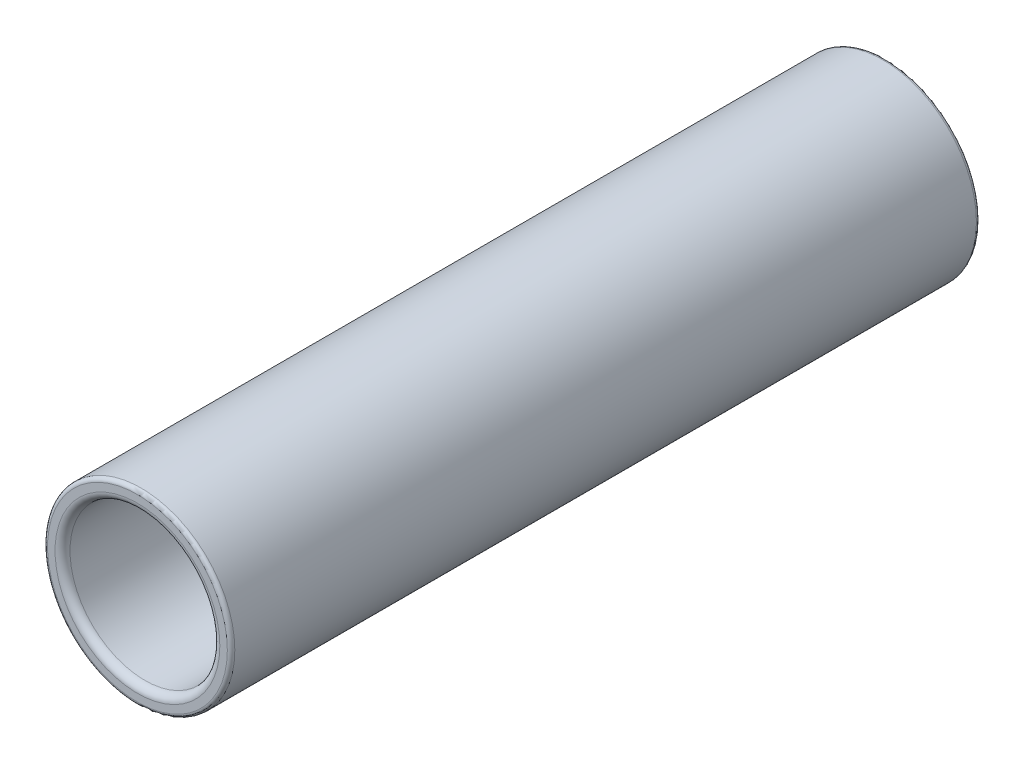
ISO-10303-21;
HEADER;
FILE_DESCRIPTION(('STEP AP214'),'2;1');
FILE_NAME('part.step','',(''),(''),'','','');
FILE_SCHEMA(('AUTOMOTIVE_DESIGN { 1 0 10303 214 1 1 1 1 }'));
ENDSEC;
DATA;
#1=APPLICATION_CONTEXT('core data for automotive mechanical design processes');
#2=APPLICATION_PROTOCOL_DEFINITION('international standard','automotive_design',2000,#1);
#3=PRODUCT_CONTEXT('',#1,'mechanical');
#4=PRODUCT('Part','Part','',(#3));
#5=PRODUCT_RELATED_PRODUCT_CATEGORY('part','',(#4));
#6=PRODUCT_DEFINITION_FORMATION('','',#4);
#7=PRODUCT_DEFINITION_CONTEXT('part definition',#1,'design');
#8=PRODUCT_DEFINITION('design','',#6,#7);
#9=PRODUCT_DEFINITION_SHAPE('','',#8);
#10=(LENGTH_UNIT() NAMED_UNIT(*) SI_UNIT(.MILLI.,.METRE.));
#11=(NAMED_UNIT(*) PLANE_ANGLE_UNIT() SI_UNIT($,.RADIAN.));
#12=(NAMED_UNIT(*) SI_UNIT($,.STERADIAN.) SOLID_ANGLE_UNIT());
#13=UNCERTAINTY_MEASURE_WITH_UNIT(LENGTH_MEASURE(1.E-05),#10,'distance_accuracy_value','');
#14=(GEOMETRIC_REPRESENTATION_CONTEXT(3) GLOBAL_UNCERTAINTY_ASSIGNED_CONTEXT((#13)) GLOBAL_UNIT_ASSIGNED_CONTEXT((#10,
#11,#12)) REPRESENTATION_CONTEXT('',''));
#15=CARTESIAN_POINT('',(0.,0.,0.));
#16=DIRECTION('',(0.,0.,1.));
#17=DIRECTION('',(1.,0.,0.));
#18=AXIS2_PLACEMENT_3D('',#15,#16,#17);
#19=CARTESIAN_POINT('',(0.,0.,20.));
#20=DIRECTION('',(0.,0.,1.));
#21=DIRECTION('',(1.,0.,0.));
#22=AXIS2_PLACEMENT_3D('',#19,#20,#21);
#23=PLANE('',#22);
#24=CARTESIAN_POINT('',(0.,0.,20.));
#25=DIRECTION('',(0.,0.,1.));
#26=DIRECTION('',(1.,0.,0.));
#27=AXIS2_PLACEMENT_3D('',#24,#25,#26);
#28=CIRCLE('',#27,2.2);
#29=CARTESIAN_POINT('',(2.2,0.,20.));
#30=VERTEX_POINT('',#29);
#31=EDGE_CURVE('E10',#30,#30,#28,.F.);
#32=ORIENTED_EDGE('',*,*,#31,.T.);
#33=EDGE_LOOP('',(#32));
#34=FACE_BOUND('',#33,.T.);
#35=CARTESIAN_POINT('',(0.,0.,20.));
#36=DIRECTION('',(0.,0.,1.));
#37=DIRECTION('',(1.,0.,0.));
#38=AXIS2_PLACEMENT_3D('',#35,#36,#37);
#39=CIRCLE('',#38,2.4);
#40=CARTESIAN_POINT('',(2.4,0.,20.));
#41=VERTEX_POINT('',#40);
#42=EDGE_CURVE('E61',#41,#41,#39,.T.);
#43=ORIENTED_EDGE('',*,*,#42,.T.);
#44=EDGE_LOOP('',(#43));
#45=FACE_BOUND('',#44,.T.);
#46=ADVANCED_FACE('F37',(#34,#45),#23,.T.);
#47=CARTESIAN_POINT('',(0.,0.,0.));
#48=DIRECTION('',(0.,0.,1.));
#49=DIRECTION('',(1.,0.,0.));
#50=AXIS2_PLACEMENT_3D('',#47,#48,#49);
#51=PLANE('',#50);
#52=CARTESIAN_POINT('',(0.,0.,0.));
#53=DIRECTION('',(0.,0.,1.));
#54=DIRECTION('',(1.,0.,0.));
#55=AXIS2_PLACEMENT_3D('',#52,#53,#54);
#56=CIRCLE('',#55,2.2);
#57=CARTESIAN_POINT('',(2.2,0.,0.));
#58=VERTEX_POINT('',#57);
#59=EDGE_CURVE('E55',#58,#58,#56,.T.);
#60=ORIENTED_EDGE('',*,*,#59,.T.);
#61=EDGE_LOOP('',(#60));
#62=FACE_BOUND('',#61,.T.);
#63=CARTESIAN_POINT('',(0.,0.,0.));
#64=DIRECTION('',(0.,0.,1.));
#65=DIRECTION('',(1.,0.,0.));
#66=AXIS2_PLACEMENT_3D('',#63,#64,#65);
#67=CIRCLE('',#66,2.4);
#68=CARTESIAN_POINT('',(2.4,0.,0.));
#69=VERTEX_POINT('',#68);
#70=EDGE_CURVE('E65',#69,#69,#67,.F.);
#71=ORIENTED_EDGE('',*,*,#70,.T.);
#72=EDGE_LOOP('',(#71));
#73=FACE_BOUND('',#72,.T.);
#74=ADVANCED_FACE('F89',(#62,#73),#51,.F.);
#75=CARTESIAN_POINT('',(0.,0.,20.));
#76=DIRECTION('',(0.,0.,-1.));
#77=DIRECTION('',(-1.,0.,0.));
#78=AXIS2_PLACEMENT_3D('',#75,#76,#77);
#79=CYLINDRICAL_SURFACE('',#78,2.5);
#80=CARTESIAN_POINT('',(0.,0.,0.0999999999999994));
#81=DIRECTION('',(0.,0.,1.));
#82=DIRECTION('',(1.,0.,0.));
#83=AXIS2_PLACEMENT_3D('',#80,#81,#82);
#84=CIRCLE('',#83,2.5);
#85=CARTESIAN_POINT('',(2.5,0.,0.0999999999999994));
#86=VERTEX_POINT('',#85);
#87=EDGE_CURVE('E69',#86,#86,#84,.T.);
#88=ORIENTED_EDGE('',*,*,#87,.T.);
#89=EDGE_LOOP('',(#88));
#90=FACE_BOUND('',#89,.T.);
#91=CARTESIAN_POINT('',(0.,0.,19.9));
#92=DIRECTION('',(0.,0.,1.));
#93=DIRECTION('',(1.,0.,0.));
#94=AXIS2_PLACEMENT_3D('',#91,#92,#93);
#95=CIRCLE('',#94,2.5);
#96=CARTESIAN_POINT('',(2.5,0.,19.9));
#97=VERTEX_POINT('',#96);
#98=EDGE_CURVE('E73',#97,#97,#95,.F.);
#99=ORIENTED_EDGE('',*,*,#98,.T.);
#100=EDGE_LOOP('',(#99));
#101=FACE_BOUND('',#100,.T.);
#102=ADVANCED_FACE('F78',(#90,#101),#79,.T.);
#103=CARTESIAN_POINT('',(0.,0.,20.));
#104=DIRECTION('',(0.,0.,-1.));
#105=DIRECTION('',(-1.,0.,0.));
#106=AXIS2_PLACEMENT_3D('',#103,#104,#105);
#107=CYLINDRICAL_SURFACE('',#106,2.);
#108=CARTESIAN_POINT('',(0.,0.,0.199999999999999));
#109=DIRECTION('',(0.,0.,1.));
#110=DIRECTION('',(1.,0.,0.));
#111=AXIS2_PLACEMENT_3D('',#108,#109,#110);
#112=CIRCLE('',#111,2.);
#113=CARTESIAN_POINT('',(2.,0.,0.199999999999999));
#114=VERTEX_POINT('',#113);
#115=EDGE_CURVE('E45',#114,#114,#112,.F.);
#116=ORIENTED_EDGE('',*,*,#115,.T.);
#117=EDGE_LOOP('',(#116));
#118=FACE_BOUND('',#117,.T.);
#119=CARTESIAN_POINT('',(0.,0.,19.8));
#120=DIRECTION('',(0.,0.,1.));
#121=DIRECTION('',(1.,0.,0.));
#122=AXIS2_PLACEMENT_3D('',#119,#120,#121);
#123=CIRCLE('',#122,2.);
#124=CARTESIAN_POINT('',(2.,0.,19.8));
#125=VERTEX_POINT('',#124);
#126=EDGE_CURVE('E50',#125,#125,#123,.T.);
#127=ORIENTED_EDGE('',*,*,#126,.T.);
#128=EDGE_LOOP('',(#127));
#129=FACE_BOUND('',#128,.T.);
#130=ADVANCED_FACE('F97',(#118,#129),#107,.F.);
#131=CARTESIAN_POINT('',(0.,0.,0.0999999999999994));
#132=DIRECTION('',(0.,0.,1.));
#133=DIRECTION('',(1.,0.,0.));
#134=AXIS2_PLACEMENT_3D('',#131,#132,#133);
#135=TOROIDAL_SURFACE('',#134,2.4,0.1);
#136=ORIENTED_EDGE('',*,*,#70,.F.);
#137=EDGE_LOOP('',(#136));
#138=FACE_BOUND('',#137,.T.);
#139=ORIENTED_EDGE('',*,*,#87,.F.);
#140=EDGE_LOOP('',(#139));
#141=FACE_BOUND('',#140,.T.);
#142=ADVANCED_FACE('F84',(#138,#141),#135,.T.);
#143=CARTESIAN_POINT('',(0.,0.,19.9));
#144=DIRECTION('',(0.,0.,1.));
#145=DIRECTION('',(1.,0.,0.));
#146=AXIS2_PLACEMENT_3D('',#143,#144,#145);
#147=TOROIDAL_SURFACE('',#146,2.4,0.1);
#148=ORIENTED_EDGE('',*,*,#98,.F.);
#149=EDGE_LOOP('',(#148));
#150=FACE_BOUND('',#149,.T.);
#151=ORIENTED_EDGE('',*,*,#42,.F.);
#152=EDGE_LOOP('',(#151));
#153=FACE_BOUND('',#152,.T.);
#154=ADVANCED_FACE('F80',(#150,#153),#147,.T.);
#155=CARTESIAN_POINT('',(0.,0.,0.199999999999999));
#156=DIRECTION('',(0.,0.,1.));
#157=DIRECTION('',(1.,0.,0.));
#158=AXIS2_PLACEMENT_3D('',#155,#156,#157);
#159=TOROIDAL_SURFACE('',#158,2.2,0.2);
#160=ORIENTED_EDGE('',*,*,#115,.F.);
#161=EDGE_LOOP('',(#160));
#162=FACE_BOUND('',#161,.T.);
#163=ORIENTED_EDGE('',*,*,#59,.F.);
#164=EDGE_LOOP('',(#163));
#165=FACE_BOUND('',#164,.T.);
#166=ADVANCED_FACE('F83',(#162,#165),#159,.T.);
#167=CARTESIAN_POINT('',(0.,0.,19.8));
#168=DIRECTION('',(0.,0.,1.));
#169=DIRECTION('',(1.,0.,0.));
#170=AXIS2_PLACEMENT_3D('',#167,#168,#169);
#171=TOROIDAL_SURFACE('',#170,2.2,0.2);
#172=ORIENTED_EDGE('',*,*,#31,.F.);
#173=EDGE_LOOP('',(#172));
#174=FACE_BOUND('',#173,.T.);
#175=ORIENTED_EDGE('',*,*,#126,.F.);
#176=EDGE_LOOP('',(#175));
#177=FACE_BOUND('',#176,.T.);
#178=ADVANCED_FACE('F39',(#174,#177),#171,.T.);
#179=CLOSED_SHELL('',(#46,#74,#102,#130,#142,#154,#166,#178));
#180=MANIFOLD_SOLID_BREP('B2',#179);
#181=ADVANCED_BREP_SHAPE_REPRESENTATION('',(#18,#180),#14);
#182=SHAPE_DEFINITION_REPRESENTATION(#9,#181);
ENDSEC;
END-ISO-10303-21;
